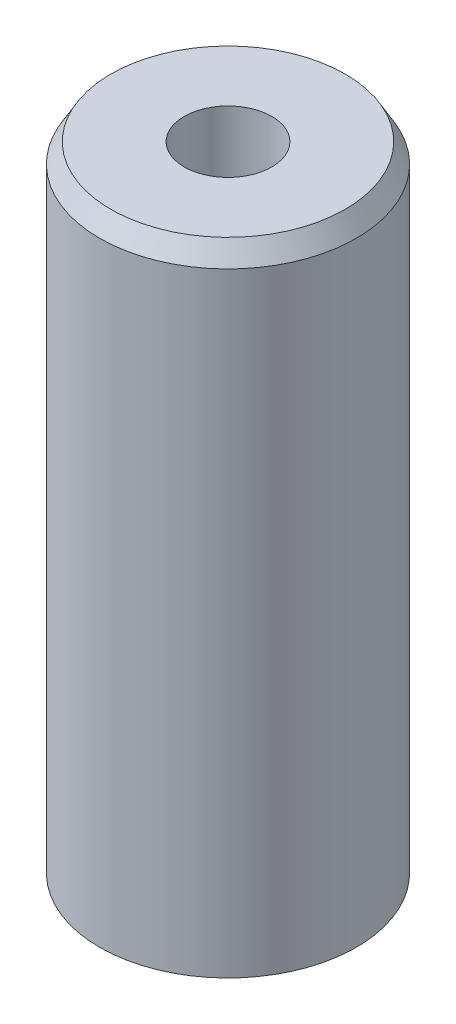
ISO-10303-21;
HEADER;
FILE_DESCRIPTION(('STEP AP214'),'2;1');
FILE_NAME('part.step','',(''),(''),'','','');
FILE_SCHEMA(('AUTOMOTIVE_DESIGN { 1 0 10303 214 1 1 1 1 }'));
ENDSEC;
DATA;
#1=APPLICATION_CONTEXT('core data for automotive mechanical design processes');
#2=APPLICATION_PROTOCOL_DEFINITION('international standard','automotive_design',2000,#1);
#3=PRODUCT_CONTEXT('',#1,'mechanical');
#4=PRODUCT('Part','Part','',(#3));
#5=PRODUCT_RELATED_PRODUCT_CATEGORY('part','',(#4));
#6=PRODUCT_DEFINITION_FORMATION('','',#4);
#7=PRODUCT_DEFINITION_CONTEXT('part definition',#1,'design');
#8=PRODUCT_DEFINITION('design','',#6,#7);
#9=PRODUCT_DEFINITION_SHAPE('','',#8);
#10=(LENGTH_UNIT() NAMED_UNIT(*) SI_UNIT(.MILLI.,.METRE.));
#11=(NAMED_UNIT(*) PLANE_ANGLE_UNIT() SI_UNIT($,.RADIAN.));
#12=(NAMED_UNIT(*) SI_UNIT($,.STERADIAN.) SOLID_ANGLE_UNIT());
#13=UNCERTAINTY_MEASURE_WITH_UNIT(LENGTH_MEASURE(1.E-05),#10,'distance_accuracy_value','');
#14=(GEOMETRIC_REPRESENTATION_CONTEXT(3) GLOBAL_UNCERTAINTY_ASSIGNED_CONTEXT((#13)) GLOBAL_UNIT_ASSIGNED_CONTEXT((#10,
#11,#12)) REPRESENTATION_CONTEXT('',''));
#15=CARTESIAN_POINT('',(0.,0.,0.));
#16=DIRECTION('',(0.,0.,1.));
#17=DIRECTION('',(1.,0.,0.));
#18=AXIS2_PLACEMENT_3D('',#15,#16,#17);
#19=CARTESIAN_POINT('',(0.,175.72374377105,0.));
#20=DIRECTION('',(0.,-1.,0.));
#21=DIRECTION('',(0.,0.,-1.));
#22=AXIS2_PLACEMENT_3D('',#19,#20,#21);
#23=CYLINDRICAL_SURFACE('',#22,35.);
#24=CARTESIAN_POINT('',(0.,170.427336107641,0.));
#25=DIRECTION('',(0.,1.,0.));
#26=DIRECTION('',(0.,0.,1.));
#27=AXIS2_PLACEMENT_3D('',#24,#25,#26);
#28=CIRCLE('',#27,35.);
#29=CARTESIAN_POINT('',(0.,170.427336107641,-35.));
#30=VERTEX_POINT('',#29);
#31=EDGE_CURVE('E50',#30,#30,#28,.F.);
#32=CARTESIAN_POINT('',(0.,3.05788239020691,0.));
#33=DIRECTION('',(0.,1.,0.));
#34=DIRECTION('',(0.,0.,1.));
#35=AXIS2_PLACEMENT_3D('',#32,#33,#34);
#36=CIRCLE('',#35,35.);
#37=CARTESIAN_POINT('',(0.,3.05788239020691,-35.));
#38=VERTEX_POINT('',#37);
#39=EDGE_CURVE('E51',#38,#38,#36,.T.);
#40=CARTESIAN_POINT('',(0.,170.427336107641,-35.));
#41=CARTESIAN_POINT('',(0.,168.683904298085,-35.));
#42=CARTESIAN_POINT('',(0.,166.940472488528,-35.));
#43=CARTESIAN_POINT('',(0.,163.453608869415,-35.));
#44=CARTESIAN_POINT('',(0.,161.710177059858,-35.));
#45=CARTESIAN_POINT('',(0.,158.223313440745,-35.));
#46=CARTESIAN_POINT('',(0.,156.479881631188,-35.));
#47=CARTESIAN_POINT('',(0.,152.993018012075,-35.));
#48=CARTESIAN_POINT('',(0.,151.249586202518,-35.));
#49=CARTESIAN_POINT('',(0.,147.762722583405,-35.));
#50=CARTESIAN_POINT('',(0.,146.019290773849,-35.));
#51=CARTESIAN_POINT('',(0.,142.532427154735,-35.));
#52=CARTESIAN_POINT('',(0.,140.788995345179,-35.));
#53=CARTESIAN_POINT('',(0.,137.302131726066,-35.));
#54=CARTESIAN_POINT('',(0.,135.558699916509,-35.));
#55=CARTESIAN_POINT('',(0.,132.071836297396,-35.));
#56=CARTESIAN_POINT('',(0.,130.328404487839,-35.));
#57=CARTESIAN_POINT('',(0.,126.841540868726,-35.));
#58=CARTESIAN_POINT('',(0.,125.098109059169,-35.));
#59=CARTESIAN_POINT('',(0.,121.611245440056,-35.));
#60=CARTESIAN_POINT('',(0.,119.8678136305,-35.));
#61=CARTESIAN_POINT('',(0.,116.380950011386,-35.));
#62=CARTESIAN_POINT('',(0.,114.63751820183,-35.));
#63=CARTESIAN_POINT('',(0.,111.150654582717,-35.));
#64=CARTESIAN_POINT('',(0.,109.40722277316,-35.));
#65=CARTESIAN_POINT('',(0.,105.920359154047,-35.));
#66=CARTESIAN_POINT('',(0.,104.17692734449,-35.));
#67=CARTESIAN_POINT('',(0.,100.690063725377,-35.));
#68=CARTESIAN_POINT('',(0.,98.9466319158203,-35.));
#69=CARTESIAN_POINT('',(0.,95.4597682967071,-35.));
#70=CARTESIAN_POINT('',(0.,93.7163364871505,-35.));
#71=CARTESIAN_POINT('',(0.,90.2294728680372,-35.));
#72=CARTESIAN_POINT('',(0.,88.4860410584806,-35.));
#73=CARTESIAN_POINT('',(0.,84.9991774393674,-35.));
#74=CARTESIAN_POINT('',(0.,83.2557456298108,-35.));
#75=CARTESIAN_POINT('',(0.,79.7688820106976,-35.));
#76=CARTESIAN_POINT('',(0.,78.025450201141,-35.));
#77=CARTESIAN_POINT('',(0.,74.5385865820278,-35.));
#78=CARTESIAN_POINT('',(0.,72.7951547724712,-35.));
#79=CARTESIAN_POINT('',(0.,69.308291153358,-35.));
#80=CARTESIAN_POINT('',(0.,67.5648593438014,-35.));
#81=CARTESIAN_POINT('',(0.,64.0779957246882,-35.));
#82=CARTESIAN_POINT('',(0.,62.3345639151315,-35.));
#83=CARTESIAN_POINT('',(0.,58.8477002960183,-35.));
#84=CARTESIAN_POINT('',(0.,57.1042684864617,-35.));
#85=CARTESIAN_POINT('',(0.,53.6174048673485,-35.));
#86=CARTESIAN_POINT('',(0.,51.8739730577919,-35.));
#87=CARTESIAN_POINT('',(0.,48.3871094386787,-35.));
#88=CARTESIAN_POINT('',(0.,46.6436776291221,-35.));
#89=CARTESIAN_POINT('',(0.,43.1568140100088,-35.));
#90=CARTESIAN_POINT('',(0.,41.4133822004522,-35.));
#91=CARTESIAN_POINT('',(0.,37.926518581339,-35.));
#92=CARTESIAN_POINT('',(0.,36.1830867717824,-35.));
#93=CARTESIAN_POINT('',(0.,32.6962231526692,-35.));
#94=CARTESIAN_POINT('',(0.,30.9527913431126,-35.));
#95=CARTESIAN_POINT('',(0.,27.4659277239994,-35.));
#96=CARTESIAN_POINT('',(0.,25.7224959144428,-35.));
#97=CARTESIAN_POINT('',(0.,22.2356322953296,-35.));
#98=CARTESIAN_POINT('',(0.,20.492200485773,-35.));
#99=CARTESIAN_POINT('',(0.,17.0053368666598,-35.));
#100=CARTESIAN_POINT('',(0.,15.2619050571031,-35.));
#101=CARTESIAN_POINT('',(0.,11.7750414379899,-35.));
#102=CARTESIAN_POINT('',(0.,10.0316096284333,-35.));
#103=CARTESIAN_POINT('',(0.,6.54474600932012,-35.));
#104=CARTESIAN_POINT('',(0.,4.80131419976351,-35.));
#105=CARTESIAN_POINT('',(0.,3.05788239020691,-35.));
#106=B_SPLINE_CURVE_WITH_KNOTS('',3,(#40,#41,#42,#43,#44,#45,#46,#47,#48,#49,#50,#51,#52,#53,
#54,#55,#56,#57,#58,#59,#60,#61,#62,#63,#64,#65,#66,#67,#68,#69,#70,#71,#72,#73,#74,#75,#76,#77,
#78,#79,#80,#81,#82,#83,#84,#85,#86,#87,#88,#89,#90,#91,#92,#93,#94,#95,#96,#97,#98,#99,#100,
#101,#102,#103,#104,#105),.UNSPECIFIED.,.F.,.F.,(4,2,2,2,2,2,2,2,2,2,2,2,2,2,2,2,2,2,2,2,2,2,2,
2,2,2,2,2,2,2,2,2,4),(0.,5.23029542866985,10.4605908573397,15.6908862860095,20.9211817146793,
26.1514771433491,31.3817725720189,36.6120680006888,41.8423634293586,47.0726588580284,
52.3029542866982,57.533249715368,62.7635451440379,67.9938405727077,73.2241360013775,
78.4544314300473,83.6847268587171,88.9150222873869,94.1453177160568,99.3756131447266,
104.605908573396,109.836204002066,115.066499430736,120.296794859406,125.527090288076,
130.757385716746,135.987681145415,141.217976574085,146.448272002755,151.678567431425,
156.908862860095,162.139158288764,167.369453717434),.UNSPECIFIED.);
#107=EDGE_CURVE('BSEAM39',#30,#38,#106,.T.);
#108=ORIENTED_EDGE('',*,*,#31,.T.);
#109=ORIENTED_EDGE('',*,*,#39,.T.);
#110=ORIENTED_EDGE('',*,*,#107,.T.);
#111=ORIENTED_EDGE('',*,*,#107,.F.);
#112=EDGE_LOOP('',(#108,#110,#109,#111));
#113=FACE_BOUND('',#112,.T.);
#114=ADVANCED_FACE('F39',(#113),#23,.T.);
#115=CARTESIAN_POINT('',(0.,175.72374377105,0.));
#116=DIRECTION('',(0.,1.,0.));
#117=DIRECTION('',(0.,0.,1.));
#118=AXIS2_PLACEMENT_3D('',#115,#116,#117);
#119=PLANE('',#118);
#120=CARTESIAN_POINT('',(0.,175.72374377105,0.));
#121=DIRECTION('',(0.,1.,0.));
#122=DIRECTION('',(0.,0.,1.));
#123=AXIS2_PLACEMENT_3D('',#120,#121,#122);
#124=CIRCLE('',#123,31.9421176097931);
#125=CARTESIAN_POINT('',(0.,175.72374377105,-31.9421176097931));
#126=VERTEX_POINT('',#125);
#127=EDGE_CURVE('E54',#126,#126,#124,.T.);
#128=ORIENTED_EDGE('',*,*,#127,.T.);
#129=EDGE_LOOP('',(#128));
#130=FACE_BOUND('',#129,.T.);
#131=CARTESIAN_POINT('',(0.,175.72374377105,0.));
#132=DIRECTION('',(0.,1.,0.));
#133=DIRECTION('',(0.,0.,1.));
#134=AXIS2_PLACEMENT_3D('',#131,#132,#133);
#135=CIRCLE('',#134,11.9395844183263);
#136=CARTESIAN_POINT('',(0.,175.72374377105,11.9395844183263));
#137=VERTEX_POINT('',#136);
#138=EDGE_CURVE('E58',#137,#137,#135,.T.);
#139=ORIENTED_EDGE('',*,*,#138,.F.);
#140=EDGE_LOOP('',(#139));
#141=FACE_BOUND('',#140,.T.);
#142=ADVANCED_FACE('F69',(#130,#141),#119,.T.);
#143=CARTESIAN_POINT('',(0.,0.,0.));
#144=DIRECTION('',(0.,1.,0.));
#145=DIRECTION('',(0.,0.,1.));
#146=AXIS2_PLACEMENT_3D('',#143,#144,#145);
#147=PLANE('',#146);
#148=CARTESIAN_POINT('',(0.,0.,0.));
#149=DIRECTION('',(0.,1.,0.));
#150=DIRECTION('',(0.,0.,1.));
#151=AXIS2_PLACEMENT_3D('',#148,#149,#150);
#152=CIRCLE('',#151,29.7035923365914);
#153=CARTESIAN_POINT('',(0.,0.,29.7035923365914));
#154=VERTEX_POINT('',#153);
#155=EDGE_CURVE('E10',#154,#154,#152,.F.);
#156=ORIENTED_EDGE('',*,*,#155,.T.);
#157=EDGE_LOOP('',(#156));
#158=FACE_BOUND('',#157,.T.);
#159=CARTESIAN_POINT('',(0.,0.,0.));
#160=DIRECTION('',(0.,1.,0.));
#161=DIRECTION('',(0.,0.,1.));
#162=AXIS2_PLACEMENT_3D('',#159,#160,#161);
#163=CIRCLE('',#162,11.9395844183263);
#164=CARTESIAN_POINT('',(0.,0.,11.9395844183263));
#165=VERTEX_POINT('',#164);
#166=EDGE_CURVE('E63',#165,#165,#163,.T.);
#167=ORIENTED_EDGE('',*,*,#166,.T.);
#168=EDGE_LOOP('',(#167));
#169=FACE_BOUND('',#168,.T.);
#170=ADVANCED_FACE('F75',(#158,#169),#147,.F.);
#171=CARTESIAN_POINT('',(0.,175.72374377105,0.));
#172=DIRECTION('',(0.,-1.,0.));
#173=DIRECTION('',(0.,0.,-1.));
#174=AXIS2_PLACEMENT_3D('',#171,#172,#173);
#175=CYLINDRICAL_SURFACE('',#174,11.9395844183263);
#176=ORIENTED_EDGE('',*,*,#138,.T.);
#177=EDGE_LOOP('',(#176));
#178=FACE_BOUND('',#177,.T.);
#179=ORIENTED_EDGE('',*,*,#166,.F.);
#180=EDGE_LOOP('',(#179));
#181=FACE_BOUND('',#180,.T.);
#182=ADVANCED_FACE('F70',(#178,#181),#175,.F.);
#183=CARTESIAN_POINT('',(0.,175.72374377105,0.));
#184=DIRECTION('',(0.,-1.,0.));
#185=DIRECTION('',(0.,0.,-1.));
#186=AXIS2_PLACEMENT_3D('',#183,#184,#185);
#187=CONICAL_SURFACE('',#186,31.9421176097931,0.523598775598297);
#188=CARTESIAN_POINT('',(0.,170.427336107641,-35.));
#189=CARTESIAN_POINT('',(0.,170.482507020802,-34.9681470584354));
#190=CARTESIAN_POINT('',(0.,170.537677933962,-34.9362941168707));
#191=CARTESIAN_POINT('',(0.,170.648019760283,-34.8725882337414));
#192=CARTESIAN_POINT('',(0.,170.703190673444,-34.8407352921767));
#193=CARTESIAN_POINT('',(0.,170.813532499765,-34.7770294090474));
#194=CARTESIAN_POINT('',(0.,170.868703412925,-34.7451764674828));
#195=CARTESIAN_POINT('',(0.,170.979045239246,-34.6814705843535));
#196=CARTESIAN_POINT('',(0.,171.034216152407,-34.6496176427888));
#197=CARTESIAN_POINT('',(0.,171.144557978728,-34.5859117596595));
#198=CARTESIAN_POINT('',(0.,171.199728891888,-34.5540588180948));
#199=CARTESIAN_POINT('',(0.,171.310070718209,-34.4903529349655));
#200=CARTESIAN_POINT('',(0.,171.36524163137,-34.4584999934009));
#201=CARTESIAN_POINT('',(0.,171.475583457691,-34.3947941102716));
#202=CARTESIAN_POINT('',(0.,171.530754370851,-34.3629411687069));
#203=CARTESIAN_POINT('',(0.,171.641096197172,-34.2992352855776));
#204=CARTESIAN_POINT('',(0.,171.696267110333,-34.267382344013));
#205=CARTESIAN_POINT('',(0.,171.806608936654,-34.2036764608836));
#206=CARTESIAN_POINT('',(0.,171.861779849814,-34.171823519319));
#207=CARTESIAN_POINT('',(0.,171.972121676135,-34.1081176361897));
#208=CARTESIAN_POINT('',(0.,172.027292589296,-34.076264694625));
#209=CARTESIAN_POINT('',(0.,172.137634415617,-34.0125588114957));
#210=CARTESIAN_POINT('',(0.,172.192805328777,-33.980705869931));
#211=CARTESIAN_POINT('',(0.,172.303147155098,-33.9169999868017));
#212=CARTESIAN_POINT('',(0.,172.358318068259,-33.8851470452371));
#213=CARTESIAN_POINT('',(0.,172.46865989458,-33.8214411621078));
#214=CARTESIAN_POINT('',(0.,172.52383080774,-33.7895882205431));
#215=CARTESIAN_POINT('',(0.,172.634172634061,-33.7258823374138));
#216=CARTESIAN_POINT('',(0.,172.689343547222,-33.6940293958491));
#217=CARTESIAN_POINT('',(0.,172.799685373543,-33.6303235127198));
#218=CARTESIAN_POINT('',(0.,172.854856286703,-33.5984705711552));
#219=CARTESIAN_POINT('',(0.,172.965198113024,-33.5347646880259));
#220=CARTESIAN_POINT('',(0.,173.020369026185,-33.5029117464612));
#221=CARTESIAN_POINT('',(0.,173.130710852506,-33.4392058633319));
#222=CARTESIAN_POINT('',(0.,173.185881765666,-33.4073529217672));
#223=CARTESIAN_POINT('',(0.,173.296223591987,-33.3436470386379));
#224=CARTESIAN_POINT('',(0.,173.351394505148,-33.3117940970733));
#225=CARTESIAN_POINT('',(0.,173.461736331469,-33.248088213944));
#226=CARTESIAN_POINT('',(0.,173.516907244629,-33.2162352723793));
#227=CARTESIAN_POINT('',(0.,173.627249070951,-33.15252938925));
#228=CARTESIAN_POINT('',(0.,173.682419984111,-33.1206764476853));
#229=CARTESIAN_POINT('',(0.,173.792761810432,-33.056970564556));
#230=CARTESIAN_POINT('',(0.,173.847932723592,-33.0251176229914));
#231=CARTESIAN_POINT('',(0.,173.958274549914,-32.9614117398621));
#232=CARTESIAN_POINT('',(0.,174.013445463074,-32.9295587982974));
#233=CARTESIAN_POINT('',(0.,174.123787289395,-32.8658529151681));
#234=CARTESIAN_POINT('',(0.,174.178958202556,-32.8339999736034));
#235=CARTESIAN_POINT('',(0.,174.289300028877,-32.7702940904741));
#236=CARTESIAN_POINT('',(0.,174.344470942037,-32.7384411489095));
#237=CARTESIAN_POINT('',(0.,174.454812768358,-32.6747352657802));
#238=CARTESIAN_POINT('',(0.,174.509983681519,-32.6428823242155));
#239=CARTESIAN_POINT('',(0.,174.62032550784,-32.5791764410862));
#240=CARTESIAN_POINT('',(0.,174.675496421,-32.5473234995215));
#241=CARTESIAN_POINT('',(0.,174.785838247321,-32.4836176163922));
#242=CARTESIAN_POINT('',(0.,174.841009160482,-32.4517646748276));
#243=CARTESIAN_POINT('',(0.,174.951350986803,-32.3880587916983));
#244=CARTESIAN_POINT('',(0.,175.006521899963,-32.3562058501336));
#245=CARTESIAN_POINT('',(0.,175.116863726284,-32.2924999670043));
#246=CARTESIAN_POINT('',(0.,175.172034639445,-32.2606470254396));
#247=CARTESIAN_POINT('',(0.,175.282376465766,-32.1969411423103));
#248=CARTESIAN_POINT('',(0.,175.337547378926,-32.1650882007457));
#249=CARTESIAN_POINT('',(0.,175.447889205247,-32.1013823176164));
#250=CARTESIAN_POINT('',(0.,175.503060118408,-32.0695293760517));
#251=CARTESIAN_POINT('',(0.,175.613401944729,-32.0058234929224));
#252=CARTESIAN_POINT('',(0.,175.668572857889,-31.9739705513577));
#253=CARTESIAN_POINT('',(0.,175.72374377105,-31.9421176097931));
#254=B_SPLINE_CURVE_WITH_KNOTS('',3,(#188,#189,#190,#191,#192,#193,#194,#195,#196,#197,#198,
#199,#200,#201,#202,#203,#204,#205,#206,#207,#208,#209,#210,#211,#212,#213,#214,#215,#216,#217,
#218,#219,#220,#221,#222,#223,#224,#225,#226,#227,#228,#229,#230,#231,#232,#233,#234,#235,#236,
#237,#238,#239,#240,#241,#242,#243,#244,#245,#246,#247,#248,#249,#250,#251,#252,#253),
.UNSPECIFIED.,.F.,.F.,(4,2,2,2,2,2,2,2,2,2,2,2,2,2,2,2,2,2,2,2,2,2,2,2,2,2,2,2,2,2,2,2,4),(0.,
0.191117649387948,0.382235298775876,0.573352948163804,0.764470597551756,0.95558824693968,
1.14670589632761,1.33782354571554,1.52894119510348,1.72005884449141,1.91117649387934,
2.10229414326729,2.29341179265522,2.48452944204314,2.67564709143107,2.86676474081902,
3.05788239020695,3.24900003959488,3.44011768898283,3.63123533837075,3.82235298775868,
4.01347063714661,4.20458828653456,4.39570593592248,4.58682358531041,4.77794123469836,
4.96905888408629,5.16017653347422,5.35129418286214,5.5424118322501,5.73352948163802,
5.92464713102595,6.1157647804139),.UNSPECIFIED.);
#255=EDGE_CURVE('BSEAM81',#30,#126,#254,.T.);
#256=ORIENTED_EDGE('',*,*,#31,.F.);
#257=ORIENTED_EDGE('',*,*,#127,.F.);
#258=ORIENTED_EDGE('',*,*,#255,.T.);
#259=ORIENTED_EDGE('',*,*,#255,.F.);
#260=EDGE_LOOP('',(#256,#258,#257,#259));
#261=FACE_BOUND('',#260,.T.);
#262=ADVANCED_FACE('F81',(#261),#187,.T.);
#263=CARTESIAN_POINT('',(0.,3.05788239020691,0.));
#264=DIRECTION('',(0.,1.,0.));
#265=DIRECTION('',(0.,0.,1.));
#266=AXIS2_PLACEMENT_3D('',#263,#264,#265);
#267=CONICAL_SURFACE('',#266,35.,1.0471975511966);
#268=ORIENTED_EDGE('',*,*,#155,.F.);
#269=EDGE_LOOP('',(#268));
#270=FACE_BOUND('',#269,.T.);
#271=ORIENTED_EDGE('',*,*,#39,.F.);
#272=EDGE_LOOP('',(#271));
#273=FACE_BOUND('',#272,.T.);
#274=ADVANCED_FACE('F45',(#270,#273),#267,.T.);
#275=CLOSED_SHELL('',(#114,#142,#170,#182,#262,#274));
#276=MANIFOLD_SOLID_BREP('B2',#275);
#277=ADVANCED_BREP_SHAPE_REPRESENTATION('',(#18,#276),#14);
#278=SHAPE_DEFINITION_REPRESENTATION(#9,#277);
ENDSEC;
END-ISO-10303-21;
